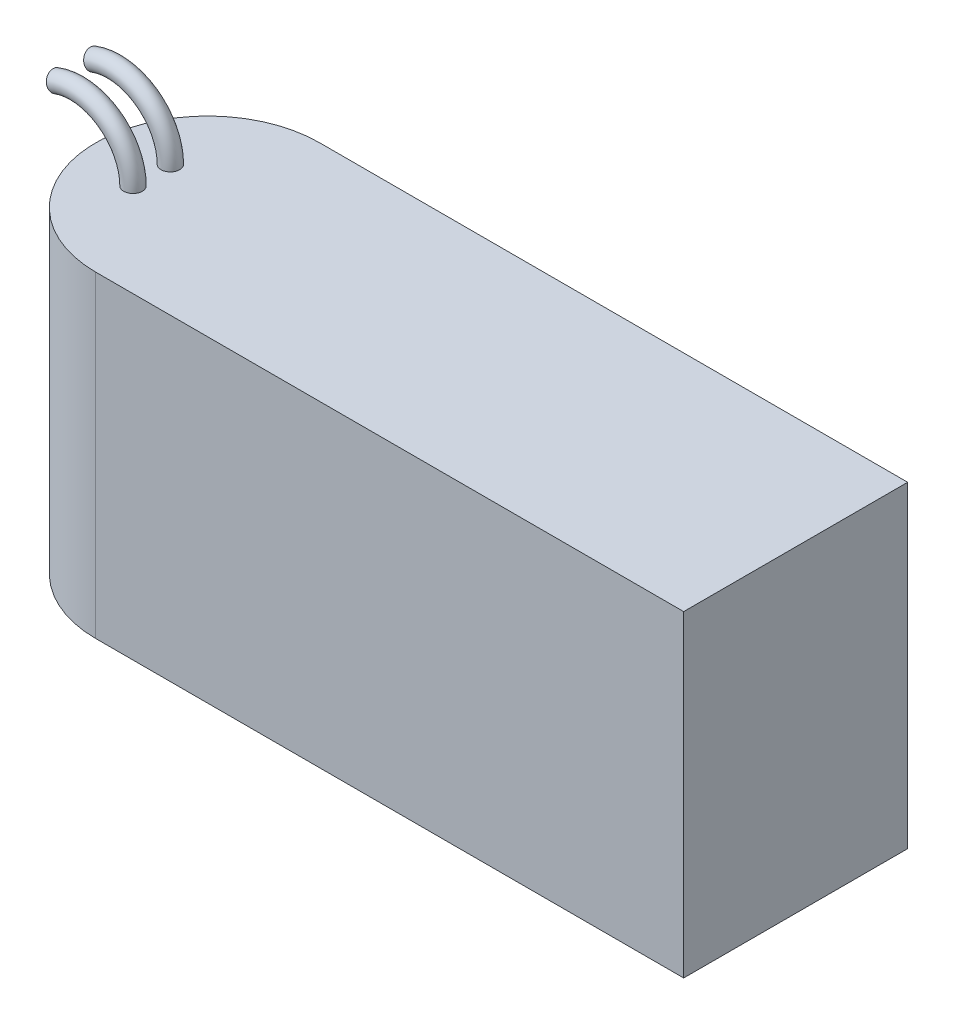
ISO-10303-21;
HEADER;
FILE_DESCRIPTION(('STEP AP214'),'2;1');
FILE_NAME('part.step','',(''),(''),'','','');
FILE_SCHEMA(('AUTOMOTIVE_DESIGN { 1 0 10303 214 1 1 1 1 }'));
ENDSEC;
DATA;
#1=APPLICATION_CONTEXT('core data for automotive mechanical design processes');
#2=APPLICATION_PROTOCOL_DEFINITION('international standard','automotive_design',2000,#1);
#3=PRODUCT_CONTEXT('',#1,'mechanical');
#4=PRODUCT('Part','Part','',(#3));
#5=PRODUCT_RELATED_PRODUCT_CATEGORY('part','',(#4));
#6=PRODUCT_DEFINITION_FORMATION('','',#4);
#7=PRODUCT_DEFINITION_CONTEXT('part definition',#1,'design');
#8=PRODUCT_DEFINITION('design','',#6,#7);
#9=PRODUCT_DEFINITION_SHAPE('','',#8);
#10=(LENGTH_UNIT() NAMED_UNIT(*) SI_UNIT(.MILLI.,.METRE.));
#11=(NAMED_UNIT(*) PLANE_ANGLE_UNIT() SI_UNIT($,.RADIAN.));
#12=(NAMED_UNIT(*) SI_UNIT($,.STERADIAN.) SOLID_ANGLE_UNIT());
#13=UNCERTAINTY_MEASURE_WITH_UNIT(LENGTH_MEASURE(1.E-05),#10,'distance_accuracy_value','');
#14=(GEOMETRIC_REPRESENTATION_CONTEXT(3) GLOBAL_UNCERTAINTY_ASSIGNED_CONTEXT((#13)) GLOBAL_UNIT_ASSIGNED_CONTEXT((#10,
#11,#12)) REPRESENTATION_CONTEXT('',''));
#15=CARTESIAN_POINT('',(0.,0.,0.));
#16=DIRECTION('',(0.,0.,1.));
#17=DIRECTION('',(1.,0.,0.));
#18=AXIS2_PLACEMENT_3D('',#15,#16,#17);
#19=CARTESIAN_POINT('',(0.,34.,-12.));
#20=DIRECTION('',(0.,-1.,0.));
#21=DIRECTION('',(0.,0.,-1.));
#22=AXIS2_PLACEMENT_3D('',#19,#20,#21);
#23=CYLINDRICAL_SURFACE('',#22,12.);
#24=CARTESIAN_POINT('',(0.,0.,-12.));
#25=DIRECTION('',(0.,1.,0.));
#26=DIRECTION('',(0.,0.,1.));
#27=AXIS2_PLACEMENT_3D('',#24,#25,#26);
#28=CIRCLE('',#27,12.);
#29=CARTESIAN_POINT('',(0.,0.,-24.));
#30=VERTEX_POINT('',#29);
#31=CARTESIAN_POINT('',(0.,0.,0.));
#32=VERTEX_POINT('',#31);
#33=EDGE_CURVE('E135',#30,#32,#28,.T.);
#34=ORIENTED_EDGE('',*,*,#33,.T.);
#35=DIRECTION('',(0.,-1.,0.));
#36=VECTOR('',#35,1.);
#37=CARTESIAN_POINT('',(0.,34.,0.));
#38=LINE('',#37,#36);
#39=CARTESIAN_POINT('',(0.,34.,0.));
#40=VERTEX_POINT('',#39);
#41=EDGE_CURVE('E124',#40,#32,#38,.T.);
#42=ORIENTED_EDGE('',*,*,#41,.F.);
#43=CARTESIAN_POINT('',(0.,34.,-12.));
#44=DIRECTION('',(0.,1.,0.));
#45=DIRECTION('',(0.,0.,1.));
#46=AXIS2_PLACEMENT_3D('',#43,#44,#45);
#47=CIRCLE('',#46,12.);
#48=CARTESIAN_POINT('',(0.,34.,-24.));
#49=VERTEX_POINT('',#48);
#50=EDGE_CURVE('E116',#49,#40,#47,.T.);
#51=ORIENTED_EDGE('',*,*,#50,.F.);
#52=DIRECTION('',(0.,-1.,0.));
#53=VECTOR('',#52,1.);
#54=CARTESIAN_POINT('',(0.,34.,-24.));
#55=LINE('',#54,#53);
#56=EDGE_CURVE('E131',#49,#30,#55,.T.);
#57=ORIENTED_EDGE('',*,*,#56,.T.);
#58=EDGE_LOOP('',(#34,#42,#51,#57));
#59=FACE_BOUND('',#58,.T.);
#60=ADVANCED_FACE('F63',(#59),#23,.T.);
#61=CARTESIAN_POINT('',(0.,34.,0.));
#62=DIRECTION('',(0.,0.,-1.));
#63=DIRECTION('',(-1.,0.,0.));
#64=AXIS2_PLACEMENT_3D('',#61,#62,#63);
#65=PLANE('',#64);
#66=DIRECTION('',(1.,0.,0.));
#67=VECTOR('',#66,1.);
#68=CARTESIAN_POINT('',(0.,0.,0.));
#69=LINE('',#68,#67);
#70=CARTESIAN_POINT('',(63.,0.,0.));
#71=VERTEX_POINT('',#70);
#72=EDGE_CURVE('E122',#32,#71,#69,.T.);
#73=ORIENTED_EDGE('',*,*,#72,.T.);
#74=DIRECTION('',(0.,-1.,0.));
#75=VECTOR('',#74,1.);
#76=CARTESIAN_POINT('',(63.,34.,0.));
#77=LINE('',#76,#75);
#78=CARTESIAN_POINT('',(63.,34.,0.));
#79=VERTEX_POINT('',#78);
#80=EDGE_CURVE('E120',#79,#71,#77,.T.);
#81=ORIENTED_EDGE('',*,*,#80,.F.);
#82=DIRECTION('',(1.,0.,0.));
#83=VECTOR('',#82,1.);
#84=CARTESIAN_POINT('',(0.,34.,0.));
#85=LINE('',#84,#83);
#86=EDGE_CURVE('E111',#40,#79,#85,.T.);
#87=ORIENTED_EDGE('',*,*,#86,.F.);
#88=ORIENTED_EDGE('',*,*,#41,.T.);
#89=EDGE_LOOP('',(#73,#81,#87,#88));
#90=FACE_BOUND('',#89,.T.);
#91=ADVANCED_FACE('F121',(#90),#65,.F.);
#92=CARTESIAN_POINT('',(63.,34.,0.));
#93=DIRECTION('',(-1.,0.,0.));
#94=DIRECTION('',(0.,0.,1.));
#95=AXIS2_PLACEMENT_3D('',#92,#93,#94);
#96=PLANE('',#95);
#97=DIRECTION('',(0.,0.,-1.));
#98=VECTOR('',#97,1.);
#99=CARTESIAN_POINT('',(63.,0.,0.));
#100=LINE('',#99,#98);
#101=CARTESIAN_POINT('',(63.,0.,-24.));
#102=VERTEX_POINT('',#101);
#103=EDGE_CURVE('E97',#71,#102,#100,.T.);
#104=ORIENTED_EDGE('',*,*,#103,.T.);
#105=DIRECTION('',(0.,-1.,0.));
#106=VECTOR('',#105,1.);
#107=CARTESIAN_POINT('',(63.,34.,-24.));
#108=LINE('',#107,#106);
#109=CARTESIAN_POINT('',(63.,34.,-24.));
#110=VERTEX_POINT('',#109);
#111=EDGE_CURVE('E125',#110,#102,#108,.T.);
#112=ORIENTED_EDGE('',*,*,#111,.F.);
#113=DIRECTION('',(0.,0.,-1.));
#114=VECTOR('',#113,1.);
#115=CARTESIAN_POINT('',(63.,34.,0.));
#116=LINE('',#115,#114);
#117=EDGE_CURVE('E114',#79,#110,#116,.T.);
#118=ORIENTED_EDGE('',*,*,#117,.F.);
#119=ORIENTED_EDGE('',*,*,#80,.T.);
#120=EDGE_LOOP('',(#104,#112,#118,#119));
#121=FACE_BOUND('',#120,.T.);
#122=ADVANCED_FACE('F127',(#121),#96,.F.);
#123=CARTESIAN_POINT('',(63.,34.,-24.));
#124=DIRECTION('',(0.,0.,1.));
#125=DIRECTION('',(1.,0.,0.));
#126=AXIS2_PLACEMENT_3D('',#123,#124,#125);
#127=PLANE('',#126);
#128=DIRECTION('',(-1.,0.,0.));
#129=VECTOR('',#128,1.);
#130=CARTESIAN_POINT('',(63.,0.,-24.));
#131=LINE('',#130,#129);
#132=EDGE_CURVE('E103',#102,#30,#131,.T.);
#133=ORIENTED_EDGE('',*,*,#132,.T.);
#134=ORIENTED_EDGE('',*,*,#56,.F.);
#135=DIRECTION('',(-1.,0.,0.));
#136=VECTOR('',#135,1.);
#137=CARTESIAN_POINT('',(63.,34.,-24.));
#138=LINE('',#137,#136);
#139=EDGE_CURVE('E80',#110,#49,#138,.T.);
#140=ORIENTED_EDGE('',*,*,#139,.F.);
#141=ORIENTED_EDGE('',*,*,#111,.T.);
#142=EDGE_LOOP('',(#133,#134,#140,#141));
#143=FACE_BOUND('',#142,.T.);
#144=ADVANCED_FACE('F159',(#143),#127,.F.);
#145=CARTESIAN_POINT('',(0.,34.,-12.));
#146=DIRECTION('',(0.,1.,0.));
#147=DIRECTION('',(0.,0.,1.));
#148=AXIS2_PLACEMENT_3D('',#145,#146,#147);
#149=PLANE('',#148);
#150=CARTESIAN_POINT('',(-6.,34.,-10.));
#151=DIRECTION('',(0.,1.,0.));
#152=DIRECTION('',(0.,0.,1.));
#153=AXIS2_PLACEMENT_3D('',#150,#151,#152);
#154=CIRCLE('',#153,1.);
#155=CARTESIAN_POINT('',(-5.,34.,-10.));
#156=VERTEX_POINT('',#155);
#157=EDGE_CURVE('E12',#156,#156,#154,.T.);
#158=ORIENTED_EDGE('',*,*,#157,.F.);
#159=EDGE_LOOP('',(#158));
#160=FACE_BOUND('',#159,.T.);
#161=CARTESIAN_POINT('',(-6.,34.,-14.));
#162=DIRECTION('',(0.,1.,0.));
#163=DIRECTION('',(0.,0.,1.));
#164=AXIS2_PLACEMENT_3D('',#161,#162,#163);
#165=CIRCLE('',#164,1.);
#166=CARTESIAN_POINT('',(-5.,34.,-14.));
#167=VERTEX_POINT('',#166);
#168=EDGE_CURVE('E72',#167,#167,#165,.T.);
#169=ORIENTED_EDGE('',*,*,#168,.F.);
#170=EDGE_LOOP('',(#169));
#171=FACE_BOUND('',#170,.T.);
#172=ORIENTED_EDGE('',*,*,#50,.T.);
#173=ORIENTED_EDGE('',*,*,#86,.T.);
#174=ORIENTED_EDGE('',*,*,#117,.T.);
#175=ORIENTED_EDGE('',*,*,#139,.T.);
#176=EDGE_LOOP('',(#172,#173,#174,#175));
#177=FACE_BOUND('',#176,.T.);
#178=ADVANCED_FACE('F112',(#160,#171,#177),#149,.T.);
#179=CARTESIAN_POINT('',(0.,0.,-12.));
#180=DIRECTION('',(0.,1.,0.));
#181=DIRECTION('',(0.,0.,1.));
#182=AXIS2_PLACEMENT_3D('',#179,#180,#181);
#183=PLANE('',#182);
#184=ORIENTED_EDGE('',*,*,#33,.F.);
#185=ORIENTED_EDGE('',*,*,#132,.F.);
#186=ORIENTED_EDGE('',*,*,#103,.F.);
#187=ORIENTED_EDGE('',*,*,#72,.F.);
#188=EDGE_LOOP('',(#184,#185,#186,#187));
#189=FACE_BOUND('',#188,.T.);
#190=ADVANCED_FACE('F158',(#189),#183,.F.);
#191=CARTESIAN_POINT('',(-14.2268467899628,39.649546094065,-14.));
#192=DIRECTION('',(-0.933307359696701,-0.35907850441926,0.));
#193=DIRECTION('',(0.,0.,1.));
#194=AXIS2_PLACEMENT_3D('',#191,#192,#193);
#195=PLANE('',#194);
#196=CARTESIAN_POINT('',(-14.2268467899628,39.649546094065,-14.));
#197=DIRECTION('',(-0.933307359696701,-0.35907850441926,0.));
#198=DIRECTION('',(0.,0.,1.));
#199=AXIS2_PLACEMENT_3D('',#196,#197,#198);
#200=CIRCLE('',#199,1.);
#201=CARTESIAN_POINT('',(-14.5859252943821,40.5828534537617,-14.));
#202=VERTEX_POINT('',#201);
#203=EDGE_CURVE('E139',#202,#202,#200,.T.);
#204=ORIENTED_EDGE('',*,*,#203,.T.);
#205=EDGE_LOOP('',(#204));
#206=FACE_BOUND('',#205,.T.);
#207=ADVANCED_FACE('F166',(#206),#195,.T.);
#208=CARTESIAN_POINT('',(-12.0532535561499,34.,-14.));
#209=DIRECTION('',(0.,0.,1.));
#210=DIRECTION('',(1.,0.,0.));
#211=AXIS2_PLACEMENT_3D('',#208,#209,#210);
#212=TOROIDAL_SURFACE('',#211,6.05325355614992,1.);
#213=CARTESIAN_POINT('',(-12.0532535561499,34.,-14.));
#214=DIRECTION('',(0.,0.,1.));
#215=DIRECTION('',(1.,0.,0.));
#216=AXIS2_PLACEMENT_3D('',#213,#214,#215);
#217=CIRCLE('',#216,7.05325355614992);
#218=EDGE_CURVE('',#167,#202,#217,.T.);
#219=ORIENTED_EDGE('',*,*,#168,.T.);
#220=ORIENTED_EDGE('',*,*,#203,.F.);
#221=ORIENTED_EDGE('',*,*,#218,.T.);
#222=ORIENTED_EDGE('',*,*,#218,.F.);
#223=EDGE_LOOP('',(#219,#221,#220,#222));
#224=FACE_BOUND('',#223,.T.);
#225=ADVANCED_FACE('F155',(#224),#212,.T.);
#226=CARTESIAN_POINT('',(-14.2268467899628,39.649546094065,-10.));
#227=DIRECTION('',(-0.933307359696701,-0.35907850441926,0.));
#228=DIRECTION('',(0.,0.,1.));
#229=AXIS2_PLACEMENT_3D('',#226,#227,#228);
#230=PLANE('',#229);
#231=CARTESIAN_POINT('',(-14.2268467899628,39.649546094065,-10.));
#232=DIRECTION('',(-0.933307359696701,-0.35907850441926,0.));
#233=DIRECTION('',(0.,0.,1.));
#234=AXIS2_PLACEMENT_3D('',#231,#232,#233);
#235=CIRCLE('',#234,1.);
#236=CARTESIAN_POINT('',(-14.5859252943821,40.5828534537617,-10.));
#237=VERTEX_POINT('',#236);
#238=EDGE_CURVE('E183',#237,#237,#235,.T.);
#239=ORIENTED_EDGE('',*,*,#238,.T.);
#240=EDGE_LOOP('',(#239));
#241=FACE_BOUND('',#240,.T.);
#242=ADVANCED_FACE('F188',(#241),#230,.T.);
#243=CARTESIAN_POINT('',(-12.0532535561499,34.,-10.));
#244=DIRECTION('',(0.,0.,1.));
#245=DIRECTION('',(1.,0.,0.));
#246=AXIS2_PLACEMENT_3D('',#243,#244,#245);
#247=TOROIDAL_SURFACE('',#246,6.05325355614992,1.);
#248=CARTESIAN_POINT('',(-12.0532535561499,34.,-10.));
#249=DIRECTION('',(0.,0.,1.));
#250=DIRECTION('',(1.,0.,0.));
#251=AXIS2_PLACEMENT_3D('',#248,#249,#250);
#252=CIRCLE('',#251,7.05325355614992);
#253=EDGE_CURVE('',#156,#237,#252,.T.);
#254=ORIENTED_EDGE('',*,*,#157,.T.);
#255=ORIENTED_EDGE('',*,*,#238,.F.);
#256=ORIENTED_EDGE('',*,*,#253,.T.);
#257=ORIENTED_EDGE('',*,*,#253,.F.);
#258=EDGE_LOOP('',(#254,#256,#255,#257));
#259=FACE_BOUND('',#258,.T.);
#260=ADVANCED_FACE('F190',(#259),#247,.T.);
#261=CLOSED_SHELL('',(#60,#91,#122,#144,#178,#190,#207,#225,#242,#260));
#262=MANIFOLD_SOLID_BREP('B2',#261);
#263=ADVANCED_BREP_SHAPE_REPRESENTATION('',(#18,#262),#14);
#264=SHAPE_DEFINITION_REPRESENTATION(#9,#263);
ENDSEC;
END-ISO-10303-21;
